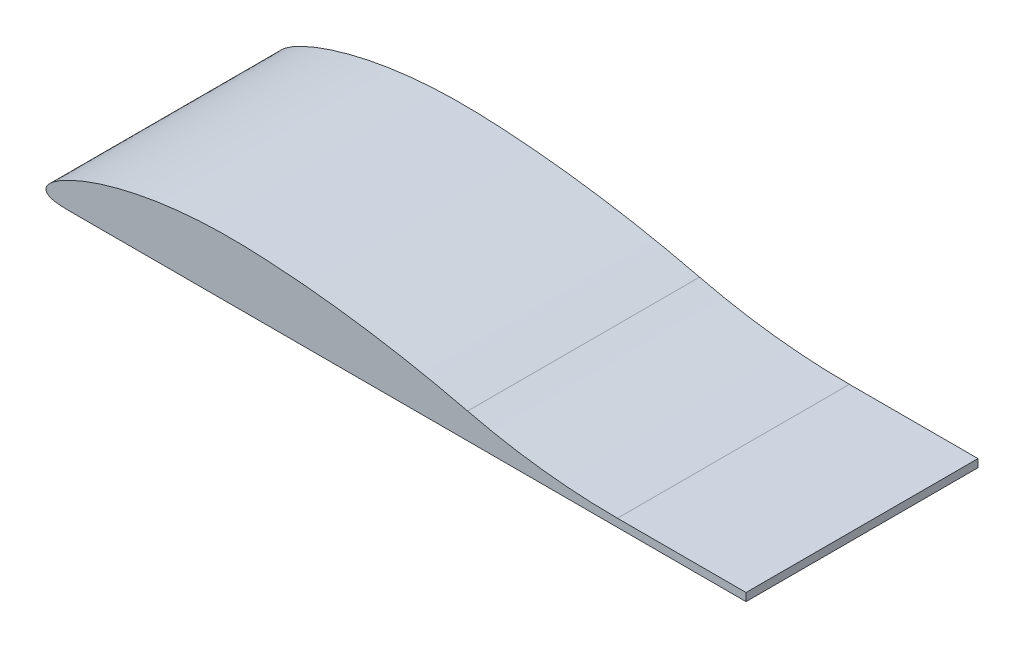
ISO-10303-21;
HEADER;
FILE_DESCRIPTION(('STEP AP214'),'2;1');
FILE_NAME('part.step','',(''),(''),'','','');
FILE_SCHEMA(('AUTOMOTIVE_DESIGN { 1 0 10303 214 1 1 1 1 }'));
ENDSEC;
DATA;
#1=APPLICATION_CONTEXT('core data for automotive mechanical design processes');
#2=APPLICATION_PROTOCOL_DEFINITION('international standard','automotive_design',2000,#1);
#3=PRODUCT_CONTEXT('',#1,'mechanical');
#4=PRODUCT('Part','Part','',(#3));
#5=PRODUCT_RELATED_PRODUCT_CATEGORY('part','',(#4));
#6=PRODUCT_DEFINITION_FORMATION('','',#4);
#7=PRODUCT_DEFINITION_CONTEXT('part definition',#1,'design');
#8=PRODUCT_DEFINITION('design','',#6,#7);
#9=PRODUCT_DEFINITION_SHAPE('','',#8);
#10=(LENGTH_UNIT() NAMED_UNIT(*) SI_UNIT(.MILLI.,.METRE.));
#11=(NAMED_UNIT(*) PLANE_ANGLE_UNIT() SI_UNIT($,.RADIAN.));
#12=(NAMED_UNIT(*) SI_UNIT($,.STERADIAN.) SOLID_ANGLE_UNIT());
#13=UNCERTAINTY_MEASURE_WITH_UNIT(LENGTH_MEASURE(1.E-05),#10,'distance_accuracy_value','');
#14=(GEOMETRIC_REPRESENTATION_CONTEXT(3) GLOBAL_UNCERTAINTY_ASSIGNED_CONTEXT((#13)) GLOBAL_UNIT_ASSIGNED_CONTEXT((#10,
#11,#12)) REPRESENTATION_CONTEXT('',''));
#15=CARTESIAN_POINT('',(0.,0.,0.));
#16=DIRECTION('',(0.,0.,1.));
#17=DIRECTION('',(1.,0.,0.));
#18=AXIS2_PLACEMENT_3D('',#15,#16,#17);
#19=CARTESIAN_POINT('',(0.,2.76599406356662,185.42));
#20=DIRECTION('',(0.,-1.,0.));
#21=DIRECTION('',(1.,0.,0.));
#22=AXIS2_PLACEMENT_3D('',#19,#20,#21);
#23=PLANE('',#22);
#24=DIRECTION('',(-1.,0.,0.));
#25=VECTOR('',#24,1.);
#26=CARTESIAN_POINT('',(0.,2.76599406356662,0.));
#27=LINE('',#26,#25);
#28=CARTESIAN_POINT('',(558.8,2.76599406356688,0.));
#29=VERTEX_POINT('',#28);
#30=CARTESIAN_POINT('',(455.986702340774,2.76599406356683,0.));
#31=VERTEX_POINT('',#30);
#32=EDGE_CURVE('E114',#29,#31,#27,.T.);
#33=ORIENTED_EDGE('',*,*,#32,.T.);
#34=DIRECTION('',(0.,0.,1.));
#35=VECTOR('',#34,1.);
#36=CARTESIAN_POINT('',(455.986702340774,2.76599406356683,185.42));
#37=LINE('',#36,#35);
#38=CARTESIAN_POINT('',(455.986702340774,2.76599406356683,185.42));
#39=VERTEX_POINT('',#38);
#40=EDGE_CURVE('E50',#31,#39,#37,.T.);
#41=ORIENTED_EDGE('',*,*,#40,.T.);
#42=DIRECTION('',(-1.,0.,0.));
#43=VECTOR('',#42,1.);
#44=CARTESIAN_POINT('',(0.,2.76599406356662,185.42));
#45=LINE('',#44,#43);
#46=CARTESIAN_POINT('',(558.8,2.76599406356688,185.42));
#47=VERTEX_POINT('',#46);
#48=EDGE_CURVE('E91',#47,#39,#45,.T.);
#49=ORIENTED_EDGE('',*,*,#48,.F.);
#50=DIRECTION('',(0.,0.,-1.));
#51=VECTOR('',#50,1.);
#52=CARTESIAN_POINT('',(558.8,2.76599406356688,185.42));
#53=LINE('',#52,#51);
#54=EDGE_CURVE('E107',#47,#29,#53,.T.);
#55=ORIENTED_EDGE('',*,*,#54,.T.);
#56=EDGE_LOOP('',(#33,#41,#49,#55));
#57=FACE_BOUND('',#56,.T.);
#58=ADVANCED_FACE('F35',(#57),#23,.F.);
#59=CARTESIAN_POINT('',(397.402740733893,0.,185.42));
#60=CARTESIAN_POINT('',(397.411698055032,0.038885320403436,185.42));
#61=CARTESIAN_POINT('',(395.109063505421,0.667730492670391,185.42));
#62=CARTESIAN_POINT('',(392.784748718469,1.49199113491221,185.42));
#63=CARTESIAN_POINT('',(387.041714069542,3.20797201327392,185.42));
#64=CARTESIAN_POINT('',(379.954865000334,5.35658969865723,185.42));
#65=CARTESIAN_POINT('',(370.615780699372,8.05897955921893,185.42));
#66=CARTESIAN_POINT('',(359.507412748466,11.1431063312715,185.42));
#67=CARTESIAN_POINT('',(346.598869357543,14.5438713747355,185.42));
#68=CARTESIAN_POINT('',(332.061103090113,18.1288417989651,185.42));
#69=CARTESIAN_POINT('',(316.038892879882,21.8064155050036,185.42));
#70=CARTESIAN_POINT('',(298.691944357754,25.449886624153,185.42));
#71=CARTESIAN_POINT('',(280.209065946268,28.9588443293727,185.42));
#72=CARTESIAN_POINT('',(260.784413321996,32.2270252294116,185.42));
#73=CARTESIAN_POINT('',(240.627196048796,35.1598340983636,185.42));
#74=CARTESIAN_POINT('',(219.959471218607,37.67781805282,185.42));
#75=CARTESIAN_POINT('',(199.01149733823,39.7118853380755,185.42));
#76=CARTESIAN_POINT('',(178.012037109444,41.1804944444643,185.42));
#77=CARTESIAN_POINT('',(157.089436587516,42.139263372195,185.42));
#78=CARTESIAN_POINT('',(136.464680266551,42.2131749394883,185.42));
#79=CARTESIAN_POINT('',(116.414649466667,41.217940478165,185.42));
#80=CARTESIAN_POINT('',(97.30433097571,39.2984877838289,185.42));
#81=CARTESIAN_POINT('',(79.3799866186788,36.5495213442708,185.42));
#82=CARTESIAN_POINT('',(62.8681190648392,33.1147834871376,185.42));
#83=CARTESIAN_POINT('',(47.9655542938233,29.1739071161229,185.42));
#84=CARTESIAN_POINT('',(34.850979219968,24.8995128608497,185.42));
#85=CARTESIAN_POINT('',(23.6592605092071,20.5034094565773,185.42));
#86=CARTESIAN_POINT('',(14.5152980764796,16.1324942141789,185.42));
#87=CARTESIAN_POINT('',(7.44822395064549,12.0104976420917,185.42));
#88=CARTESIAN_POINT('',(2.54712627731124,8.16899422843115,185.42));
#89=CARTESIAN_POINT('',(-0.453384309126816,4.79279174210024,185.42));
#90=CARTESIAN_POINT('',(-1.16956159429625,1.10557529626499,185.42));
#91=CARTESIAN_POINT('',(1.41486830061476,-1.60410388651566,185.42));
#92=CARTESIAN_POINT('',(5.70098263570552,-2.84077269687765,185.42));
#93=CARTESIAN_POINT('',(11.7555244989561,-3.57445206902531,185.42));
#94=CARTESIAN_POINT('',(19.6987641608015,-3.6327457960979,185.42));
#95=CARTESIAN_POINT('',(29.4506872946603,-3.17318046215981,185.42));
#96=CARTESIAN_POINT('',(40.9133147322604,-2.23102229721433,185.42));
#97=CARTESIAN_POINT('',(53.9547343819028,-0.933620653111706,185.42));
#98=CARTESIAN_POINT('',(68.4418443218216,0.603641828697804,185.42));
#99=CARTESIAN_POINT('',(84.2200775935775,2.26179395625605,185.42));
#100=CARTESIAN_POINT('',(101.146412331284,3.90001725460771,185.42));
#101=CARTESIAN_POINT('',(119.057408579271,5.37100954783997,185.42));
#102=CARTESIAN_POINT('',(137.798850975262,6.57353185564482,185.42));
#103=CARTESIAN_POINT('',(157.307672245746,7.34803820882025,185.42));
#104=CARTESIAN_POINT('',(177.401590339587,7.7535348034742,185.42));
#105=CARTESIAN_POINT('',(197.867291710901,8.10629507872485,185.42));
#106=CARTESIAN_POINT('',(218.383935910607,8.25382990528894,185.42));
#107=CARTESIAN_POINT('',(238.720913992722,8.21180933346506,185.42));
#108=CARTESIAN_POINT('',(258.65927683326,7.95581265533055,185.42));
#109=CARTESIAN_POINT('',(277.981187946263,7.50085728926565,185.42));
#110=CARTESIAN_POINT('',(296.474222895194,6.86319583158048,185.42));
#111=CARTESIAN_POINT('',(313.932531106465,6.08399675056258,185.42));
#112=CARTESIAN_POINT('',(330.158311416149,5.19874258601101,185.42));
#113=CARTESIAN_POINT('',(344.958833394524,4.26578253175616,185.42));
#114=CARTESIAN_POINT('',(358.177232855869,3.32463445264578,185.42));
#115=CARTESIAN_POINT('',(369.605973842651,2.44215040704408,185.42));
#116=CARTESIAN_POINT('',(379.256357552193,1.63364963837423,185.42));
#117=CARTESIAN_POINT('',(386.613193972221,1.00338863630718,185.42));
#118=CARTESIAN_POINT('',(392.568540150879,0.420302648445525,185.42));
#119=CARTESIAN_POINT('',(395.032189851431,0.277232580315452,185.42));
#120=CARTESIAN_POINT('',(397.393838715057,-0.0386452432959012,185.42));
#121=CARTESIAN_POINT('',(397.402740733893,0.,185.42));
#122=B_SPLINE_CURVE_WITH_KNOTS('',3,(#59,#60,#61,#62,#63,#64,#65,#66,#67,#68,#69,#70,#71,#72,
#73,#74,#75,#76,#77,#78,#79,#80,#81,#82,#83,#84,#85,#86,#87,#88,#89,#90,#91,#92,#93,#94,#95,#96,
#97,#98,#99,#100,#101,#102,#103,#104,#105,#106,#107,#108,#109,#110,#111,#112,#113,#114,#115,
#116,#117,#118,#119,#120,#121),.UNSPECIFIED.,.T.,.F.,(4,1,1,1,1,1,1,1,1,1,1,1,1,1,1,1,1,1,1,1,1,
1,1,1,1,1,1,1,1,1,1,1,1,1,1,1,1,1,1,1,1,1,1,1,1,1,1,1,1,1,1,1,1,1,1,1,1,1,1,1,4),(0.,
0.00137455348322331,0.00548449728179396,0.0122733609908927,0.021682195504866,0.0335806119079948,
0.0478307427867091,0.0643059527211734,0.082777332043007,0.103063756455997,0.124929016786915,
0.148149110667858,0.172444694611559,0.197572105868171,0.223268880537162,0.249227774933554,
0.275186209349679,0.300900708934774,0.326462938278696,0.351222485186767,0.374905858971967,
0.397269706218861,0.418072413969665,0.437079533175026,0.454093093767394,0.468919631578705,
0.48139171235289,0.491447126518173,0.499023571234557,0.504293734329401,0.507921918342,
0.511539686153778,0.516780527527172,0.524216490268905,0.533991629403711,0.546033957270731,
0.560220284382465,0.576403357410148,0.594370816485922,0.613951103581465,0.634916884969972,
0.657088503485648,0.680229909573905,0.704175481107386,0.72909036740664,0.754353775526935,
0.779667752347888,0.804760119952374,0.829359338708984,0.853208710008459,0.876041363199166,
0.897604065496152,0.917662212410958,0.935969860405553,0.952309787739252,0.966502759006892,
0.978350082728452,0.987731492337842,0.994510920242662,0.998633932979557,1.),.UNSPECIFIED.);
#123=DIRECTION('',(0.,0.,-1.));
#124=VECTOR('',#123,1.);
#125=SURFACE_OF_LINEAR_EXTRUSION('',#122,#124);
#126=CARTESIAN_POINT('',(336.218031035534,17.0864771968269,185.42));
#127=VERTEX_POINT('',#126);
#128=CARTESIAN_POINT('',(16.8244862805457,-3.58400593643312,185.42));
#129=VERTEX_POINT('',#128);
#130=EDGE_CURVE('E81',#127,#129,#122,.T.);
#131=ORIENTED_EDGE('',*,*,#130,.F.);
#132=DIRECTION('',(0.,0.,-1.));
#133=VECTOR('',#132,1.);
#134=CARTESIAN_POINT('',(336.21803103553,17.0864771968278,185.42));
#135=LINE('',#134,#133);
#136=CARTESIAN_POINT('',(336.218031035534,17.0864771968269,0.));
#137=VERTEX_POINT('',#136);
#138=EDGE_CURVE('E99',#127,#137,#135,.T.);
#139=ORIENTED_EDGE('',*,*,#138,.T.);
#140=CARTESIAN_POINT('',(397.402740733893,0.,0.));
#141=CARTESIAN_POINT('',(397.411698055032,0.038885320403436,0.));
#142=CARTESIAN_POINT('',(395.109063505421,0.667730492670391,0.));
#143=CARTESIAN_POINT('',(392.784748718469,1.49199113491221,0.));
#144=CARTESIAN_POINT('',(387.041714069542,3.20797201327392,0.));
#145=CARTESIAN_POINT('',(379.954865000334,5.35658969865723,0.));
#146=CARTESIAN_POINT('',(370.615780699372,8.05897955921893,0.));
#147=CARTESIAN_POINT('',(359.507412748466,11.1431063312715,0.));
#148=CARTESIAN_POINT('',(346.598869357543,14.5438713747355,0.));
#149=CARTESIAN_POINT('',(332.061103090113,18.1288417989651,0.));
#150=CARTESIAN_POINT('',(316.038892879882,21.8064155050036,0.));
#151=CARTESIAN_POINT('',(298.691944357754,25.449886624153,0.));
#152=CARTESIAN_POINT('',(280.209065946268,28.9588443293727,0.));
#153=CARTESIAN_POINT('',(260.784413321996,32.2270252294116,0.));
#154=CARTESIAN_POINT('',(240.627196048796,35.1598340983636,0.));
#155=CARTESIAN_POINT('',(219.959471218607,37.67781805282,0.));
#156=CARTESIAN_POINT('',(199.01149733823,39.7118853380755,0.));
#157=CARTESIAN_POINT('',(178.012037109444,41.1804944444643,0.));
#158=CARTESIAN_POINT('',(157.089436587516,42.139263372195,0.));
#159=CARTESIAN_POINT('',(136.464680266551,42.2131749394883,0.));
#160=CARTESIAN_POINT('',(116.414649466667,41.217940478165,0.));
#161=CARTESIAN_POINT('',(97.30433097571,39.2984877838289,0.));
#162=CARTESIAN_POINT('',(79.3799866186788,36.5495213442708,0.));
#163=CARTESIAN_POINT('',(62.8681190648392,33.1147834871376,0.));
#164=CARTESIAN_POINT('',(47.9655542938233,29.1739071161229,0.));
#165=CARTESIAN_POINT('',(34.850979219968,24.8995128608497,0.));
#166=CARTESIAN_POINT('',(23.6592605092071,20.5034094565773,0.));
#167=CARTESIAN_POINT('',(14.5152980764796,16.1324942141789,0.));
#168=CARTESIAN_POINT('',(7.44822395064549,12.0104976420917,0.));
#169=CARTESIAN_POINT('',(2.54712627731124,8.16899422843115,0.));
#170=CARTESIAN_POINT('',(-0.453384309126816,4.79279174210024,0.));
#171=CARTESIAN_POINT('',(-1.16956159429625,1.10557529626499,0.));
#172=CARTESIAN_POINT('',(1.41486830061476,-1.60410388651566,0.));
#173=CARTESIAN_POINT('',(5.70098263570552,-2.84077269687765,0.));
#174=CARTESIAN_POINT('',(11.7555244989561,-3.57445206902531,0.));
#175=CARTESIAN_POINT('',(19.6987641608015,-3.6327457960979,0.));
#176=CARTESIAN_POINT('',(29.4506872946603,-3.17318046215981,0.));
#177=CARTESIAN_POINT('',(40.9133147322604,-2.23102229721433,0.));
#178=CARTESIAN_POINT('',(53.9547343819028,-0.933620653111706,0.));
#179=CARTESIAN_POINT('',(68.4418443218216,0.603641828697804,0.));
#180=CARTESIAN_POINT('',(84.2200775935775,2.26179395625605,0.));
#181=CARTESIAN_POINT('',(101.146412331284,3.90001725460771,0.));
#182=CARTESIAN_POINT('',(119.057408579271,5.37100954783997,0.));
#183=CARTESIAN_POINT('',(137.798850975262,6.57353185564482,0.));
#184=CARTESIAN_POINT('',(157.307672245746,7.34803820882025,0.));
#185=CARTESIAN_POINT('',(177.401590339587,7.7535348034742,0.));
#186=CARTESIAN_POINT('',(197.867291710901,8.10629507872485,0.));
#187=CARTESIAN_POINT('',(218.383935910607,8.25382990528894,0.));
#188=CARTESIAN_POINT('',(238.720913992722,8.21180933346506,0.));
#189=CARTESIAN_POINT('',(258.65927683326,7.95581265533055,0.));
#190=CARTESIAN_POINT('',(277.981187946263,7.50085728926565,0.));
#191=CARTESIAN_POINT('',(296.474222895194,6.86319583158048,0.));
#192=CARTESIAN_POINT('',(313.932531106465,6.08399675056258,0.));
#193=CARTESIAN_POINT('',(330.158311416149,5.19874258601101,0.));
#194=CARTESIAN_POINT('',(344.958833394524,4.26578253175616,0.));
#195=CARTESIAN_POINT('',(358.177232855869,3.32463445264578,0.));
#196=CARTESIAN_POINT('',(369.605973842651,2.44215040704408,0.));
#197=CARTESIAN_POINT('',(379.256357552193,1.63364963837423,0.));
#198=CARTESIAN_POINT('',(386.613193972221,1.00338863630718,0.));
#199=CARTESIAN_POINT('',(392.568540150879,0.420302648445525,0.));
#200=CARTESIAN_POINT('',(395.032189851431,0.277232580315452,0.));
#201=CARTESIAN_POINT('',(397.393838715057,-0.0386452432959012,0.));
#202=CARTESIAN_POINT('',(397.402740733893,0.,0.));
#203=B_SPLINE_CURVE_WITH_KNOTS('',3,(#140,#141,#142,#143,#144,#145,#146,#147,#148,#149,#150,
#151,#152,#153,#154,#155,#156,#157,#158,#159,#160,#161,#162,#163,#164,#165,#166,#167,#168,#169,
#170,#171,#172,#173,#174,#175,#176,#177,#178,#179,#180,#181,#182,#183,#184,#185,#186,#187,#188,
#189,#190,#191,#192,#193,#194,#195,#196,#197,#198,#199,#200,#201,#202),.UNSPECIFIED.,.T.,.F.,(4,
1,1,1,1,1,1,1,1,1,1,1,1,1,1,1,1,1,1,1,1,1,1,1,1,1,1,1,1,1,1,1,1,1,1,1,1,1,1,1,1,1,1,1,1,1,1,1,1,
1,1,1,1,1,1,1,1,1,1,1,4),(0.,0.00137455348322331,0.00548449728179396,0.0122733609908927,
0.021682195504866,0.0335806119079948,0.0478307427867091,0.0643059527211734,0.082777332043007,
0.103063756455997,0.124929016786915,0.148149110667858,0.172444694611559,0.197572105868171,
0.223268880537162,0.249227774933554,0.275186209349679,0.300900708934774,0.326462938278696,
0.351222485186767,0.374905858971967,0.397269706218861,0.418072413969665,0.437079533175026,
0.454093093767394,0.468919631578705,0.48139171235289,0.491447126518173,0.499023571234557,
0.504293734329401,0.507921918342,0.511539686153778,0.516780527527172,0.524216490268905,
0.533991629403711,0.546033957270731,0.560220284382465,0.576403357410148,0.594370816485922,
0.613951103581465,0.634916884969972,0.657088503485648,0.680229909573905,0.704175481107386,
0.72909036740664,0.754353775526935,0.779667752347888,0.804760119952374,0.829359338708984,
0.853208710008459,0.876041363199166,0.897604065496152,0.917662212410958,0.935969860405553,
0.952309787739252,0.966502759006892,0.978350082728452,0.987731492337842,0.994510920242662,
0.998633932979557,1.),.UNSPECIFIED.);
#204=CARTESIAN_POINT('',(16.8244862805457,-3.58400593643312,0.));
#205=VERTEX_POINT('',#204);
#206=EDGE_CURVE('E96',#137,#205,#203,.T.);
#207=ORIENTED_EDGE('',*,*,#206,.T.);
#208=DIRECTION('',(0.,0.,-1.));
#209=VECTOR('',#208,1.);
#210=CARTESIAN_POINT('',(16.8244862805457,-3.58400593643312,185.42));
#211=LINE('',#210,#209);
#212=EDGE_CURVE('E94',#129,#205,#211,.T.);
#213=ORIENTED_EDGE('',*,*,#212,.F.);
#214=EDGE_LOOP('',(#131,#139,#207,#213));
#215=FACE_BOUND('',#214,.T.);
#216=ADVANCED_FACE('F95',(#215),#125,.F.);
#217=CARTESIAN_POINT('',(0.,-3.58400593643312,185.42));
#218=DIRECTION('',(0.,1.,0.));
#219=DIRECTION('',(-1.,0.,0.));
#220=AXIS2_PLACEMENT_3D('',#217,#218,#219);
#221=PLANE('',#220);
#222=DIRECTION('',(1.,0.,0.));
#223=VECTOR('',#222,1.);
#224=CARTESIAN_POINT('',(0.,-3.58400593643312,0.));
#225=LINE('',#224,#223);
#226=CARTESIAN_POINT('',(558.8,-3.58400593643312,0.));
#227=VERTEX_POINT('',#226);
#228=EDGE_CURVE('E119',#205,#227,#225,.T.);
#229=ORIENTED_EDGE('',*,*,#228,.T.);
#230=DIRECTION('',(0.,0.,-1.));
#231=VECTOR('',#230,1.);
#232=CARTESIAN_POINT('',(558.8,-3.58400593643312,185.42));
#233=LINE('',#232,#231);
#234=CARTESIAN_POINT('',(558.8,-3.58400593643312,185.42));
#235=VERTEX_POINT('',#234);
#236=EDGE_CURVE('E100',#235,#227,#233,.T.);
#237=ORIENTED_EDGE('',*,*,#236,.F.);
#238=DIRECTION('',(1.,0.,0.));
#239=VECTOR('',#238,1.);
#240=CARTESIAN_POINT('',(0.,-3.58400593643312,185.42));
#241=LINE('',#240,#239);
#242=EDGE_CURVE('E85',#129,#235,#241,.T.);
#243=ORIENTED_EDGE('',*,*,#242,.F.);
#244=ORIENTED_EDGE('',*,*,#212,.T.);
#245=EDGE_LOOP('',(#229,#237,#243,#244));
#246=FACE_BOUND('',#245,.T.);
#247=ADVANCED_FACE('F102',(#246),#221,.F.);
#248=CARTESIAN_POINT('',(558.8,0.,185.42));
#249=DIRECTION('',(-1.,0.,0.));
#250=DIRECTION('',(0.,0.,1.));
#251=AXIS2_PLACEMENT_3D('',#248,#249,#250);
#252=PLANE('',#251);
#253=DIRECTION('',(0.,1.,0.));
#254=VECTOR('',#253,1.);
#255=CARTESIAN_POINT('',(558.8,0.,0.));
#256=LINE('',#255,#254);
#257=EDGE_CURVE('E124',#227,#29,#256,.T.);
#258=ORIENTED_EDGE('',*,*,#257,.T.);
#259=ORIENTED_EDGE('',*,*,#54,.F.);
#260=DIRECTION('',(0.,1.,0.));
#261=VECTOR('',#260,1.);
#262=CARTESIAN_POINT('',(558.8,0.,185.42));
#263=LINE('',#262,#261);
#264=EDGE_CURVE('E105',#235,#47,#263,.T.);
#265=ORIENTED_EDGE('',*,*,#264,.F.);
#266=ORIENTED_EDGE('',*,*,#236,.T.);
#267=EDGE_LOOP('',(#258,#259,#265,#266));
#268=FACE_BOUND('',#267,.T.);
#269=ADVANCED_FACE('F134',(#268),#252,.F.);
#270=CARTESIAN_POINT('',(0.,0.,185.42));
#271=DIRECTION('',(0.,0.,1.));
#272=DIRECTION('',(1.,0.,0.));
#273=AXIS2_PLACEMENT_3D('',#270,#271,#272);
#274=PLANE('',#273);
#275=ORIENTED_EDGE('',*,*,#48,.T.);
#276=CARTESIAN_POINT('',(455.986702340774,510.765994063566,185.42));
#277=DIRECTION('',(0.,0.,1.));
#278=DIRECTION('',(1.,0.,0.));
#279=AXIS2_PLACEMENT_3D('',#276,#277,#278);
#280=CIRCLE('',#279,508.);
#281=EDGE_CURVE('E11',#39,#127,#280,.F.);
#282=ORIENTED_EDGE('',*,*,#281,.T.);
#283=ORIENTED_EDGE('',*,*,#130,.T.);
#284=ORIENTED_EDGE('',*,*,#242,.T.);
#285=ORIENTED_EDGE('',*,*,#264,.T.);
#286=EDGE_LOOP('',(#275,#282,#283,#284,#285));
#287=FACE_BOUND('',#286,.T.);
#288=ADVANCED_FACE('F83',(#287),#274,.T.);
#289=CARTESIAN_POINT('',(0.,0.,0.));
#290=DIRECTION('',(0.,0.,1.));
#291=DIRECTION('',(1.,0.,0.));
#292=AXIS2_PLACEMENT_3D('',#289,#290,#291);
#293=PLANE('',#292);
#294=ORIENTED_EDGE('',*,*,#32,.F.);
#295=ORIENTED_EDGE('',*,*,#257,.F.);
#296=ORIENTED_EDGE('',*,*,#228,.F.);
#297=ORIENTED_EDGE('',*,*,#206,.F.);
#298=CARTESIAN_POINT('',(455.986702340774,510.765994063566,0.));
#299=DIRECTION('',(0.,0.,1.));
#300=DIRECTION('',(1.,0.,0.));
#301=AXIS2_PLACEMENT_3D('',#298,#299,#300);
#302=CIRCLE('',#301,508.);
#303=EDGE_CURVE('E43',#137,#31,#302,.T.);
#304=ORIENTED_EDGE('',*,*,#303,.T.);
#305=EDGE_LOOP('',(#294,#295,#296,#297,#304));
#306=FACE_BOUND('',#305,.T.);
#307=ADVANCED_FACE('F131',(#306),#293,.F.);
#308=CARTESIAN_POINT('',(455.986702340774,510.765994063566,92.71));
#309=DIRECTION('',(0.,0.,-1.));
#310=DIRECTION('',(-1.,0.,0.));
#311=AXIS2_PLACEMENT_3D('',#308,#309,#310);
#312=CYLINDRICAL_SURFACE('',#311,508.);
#313=ORIENTED_EDGE('',*,*,#281,.F.);
#314=ORIENTED_EDGE('',*,*,#40,.F.);
#315=ORIENTED_EDGE('',*,*,#303,.F.);
#316=ORIENTED_EDGE('',*,*,#138,.F.);
#317=EDGE_LOOP('',(#313,#314,#315,#316));
#318=FACE_BOUND('',#317,.T.);
#319=ADVANCED_FACE('F37',(#318),#312,.F.);
#320=CLOSED_SHELL('',(#58,#216,#247,#269,#288,#307,#319));
#321=MANIFOLD_SOLID_BREP('B2',#320);
#322=ADVANCED_BREP_SHAPE_REPRESENTATION('',(#18,#321),#14);
#323=SHAPE_DEFINITION_REPRESENTATION(#9,#322);
ENDSEC;
END-ISO-10303-21;
